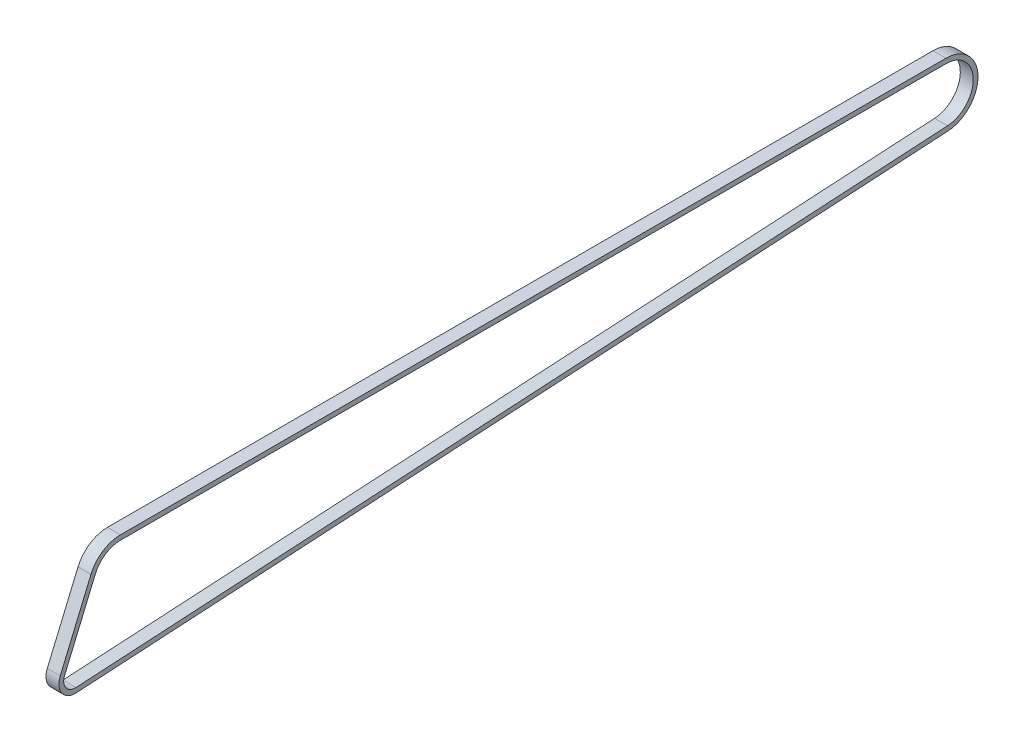
ISO-10303-21;
HEADER;
FILE_DESCRIPTION(('STEP AP214'),'2;1');
FILE_NAME('part.step','',(''),(''),'','','');
FILE_SCHEMA(('AUTOMOTIVE_DESIGN { 1 0 10303 214 1 1 1 1 }'));
ENDSEC;
DATA;
#1=APPLICATION_CONTEXT('core data for automotive mechanical design processes');
#2=APPLICATION_PROTOCOL_DEFINITION('international standard','automotive_design',2000,#1);
#3=PRODUCT_CONTEXT('',#1,'mechanical');
#4=PRODUCT('Part','Part','',(#3));
#5=PRODUCT_RELATED_PRODUCT_CATEGORY('part','',(#4));
#6=PRODUCT_DEFINITION_FORMATION('','',#4);
#7=PRODUCT_DEFINITION_CONTEXT('part definition',#1,'design');
#8=PRODUCT_DEFINITION('design','',#6,#7);
#9=PRODUCT_DEFINITION_SHAPE('','',#8);
#10=(LENGTH_UNIT() NAMED_UNIT(*) SI_UNIT(.MILLI.,.METRE.));
#11=(NAMED_UNIT(*) PLANE_ANGLE_UNIT() SI_UNIT($,.RADIAN.));
#12=(NAMED_UNIT(*) SI_UNIT($,.STERADIAN.) SOLID_ANGLE_UNIT());
#13=UNCERTAINTY_MEASURE_WITH_UNIT(LENGTH_MEASURE(1.E-05),#10,'distance_accuracy_value','');
#14=(GEOMETRIC_REPRESENTATION_CONTEXT(3) GLOBAL_UNCERTAINTY_ASSIGNED_CONTEXT((#13)) GLOBAL_UNIT_ASSIGNED_CONTEXT((#10,
#11,#12)) REPRESENTATION_CONTEXT('',''));
#15=CARTESIAN_POINT('',(0.,0.,0.));
#16=DIRECTION('',(0.,0.,1.));
#17=DIRECTION('',(1.,0.,0.));
#18=AXIS2_PLACEMENT_3D('',#15,#16,#17);
#19=CARTESIAN_POINT('',(0.,0.,0.));
#20=DIRECTION('',(-1.,0.,0.));
#21=DIRECTION('',(0.,0.,1.));
#22=AXIS2_PLACEMENT_3D('',#19,#20,#21);
#23=CYLINDRICAL_SURFACE('',#22,7.5564349965101);
#24=DIRECTION('',(-1.,0.,0.));
#25=VECTOR('',#24,1.);
#26=CARTESIAN_POINT('',(-3.,-7.54369576801666,-0.438593223944628));
#27=LINE('',#26,#25);
#28=CARTESIAN_POINT('',(3.,-7.54369576801666,-0.438593223944628));
#29=VERTEX_POINT('',#28);
#30=CARTESIAN_POINT('',(-3.,-7.54369576801666,-0.438593223944628));
#31=VERTEX_POINT('',#30);
#32=EDGE_CURVE('E250',#29,#31,#27,.T.);
#33=ORIENTED_EDGE('',*,*,#32,.F.);
#34=CARTESIAN_POINT('',(3.,0.,0.));
#35=DIRECTION('',(-1.,0.,0.));
#36=DIRECTION('',(0.,0.,1.));
#37=AXIS2_PLACEMENT_3D('',#34,#35,#36);
#38=CIRCLE('',#37,7.5564349965101);
#39=CARTESIAN_POINT('',(3.,2.94703128453617,6.95806844350122));
#40=VERTEX_POINT('',#39);
#41=EDGE_CURVE('E43',#29,#40,#38,.T.);
#42=ORIENTED_EDGE('',*,*,#41,.T.);
#43=CARTESIAN_POINT('',(3.,2.94703128453614,6.95806844350124));
#44=DIRECTION('',(-1.,0.,0.));
#45=VECTOR('',#44,1.);
#46=LINE('',#43,#45);
#47=CARTESIAN_POINT('',(-3.,2.94703128453614,6.95806844350124));
#48=VERTEX_POINT('',#47);
#49=EDGE_CURVE('E165',#40,#48,#46,.T.);
#50=ORIENTED_EDGE('',*,*,#49,.T.);
#51=CARTESIAN_POINT('',(-3.,0.,0.));
#52=DIRECTION('',(-1.,0.,0.));
#53=DIRECTION('',(0.,0.,1.));
#54=AXIS2_PLACEMENT_3D('',#51,#52,#53);
#55=CIRCLE('',#54,7.5564349965101);
#56=EDGE_CURVE('E11',#31,#48,#55,.T.);
#57=ORIENTED_EDGE('',*,*,#56,.F.);
#58=EDGE_LOOP('',(#33,#42,#50,#57));
#59=FACE_BOUND('',#58,.T.);
#60=ADVANCED_FACE('F32',(#59),#23,.T.);
#61=CARTESIAN_POINT('',(0.,0.,0.));
#62=DIRECTION('',(-1.,0.,0.));
#63=DIRECTION('',(0.,0.,1.));
#64=AXIS2_PLACEMENT_3D('',#61,#62,#63);
#65=CYLINDRICAL_SURFACE('',#64,5.35643499651009);
#66=DIRECTION('',(1.,0.,0.));
#67=VECTOR('',#66,1.);
#68=CARTESIAN_POINT('',(-3.,-5.34740469990034,-0.310900060022268));
#69=LINE('',#68,#67);
#70=CARTESIAN_POINT('',(-3.,-5.34740469990034,-0.310900060022268));
#71=VERTEX_POINT('',#70);
#72=CARTESIAN_POINT('',(3.,-5.34740469990034,-0.310900060022268));
#73=VERTEX_POINT('',#72);
#74=EDGE_CURVE('E257',#71,#73,#69,.T.);
#75=ORIENTED_EDGE('',*,*,#74,.F.);
#76=CARTESIAN_POINT('',(-3.,0.,0.));
#77=DIRECTION('',(-1.,0.,0.));
#78=DIRECTION('',(0.,0.,1.));
#79=AXIS2_PLACEMENT_3D('',#76,#77,#78);
#80=CIRCLE('',#79,5.35643499651009);
#81=CARTESIAN_POINT('',(-3.,2.08902498540513,4.93227842707517));
#82=VERTEX_POINT('',#81);
#83=EDGE_CURVE('E59',#71,#82,#80,.T.);
#84=ORIENTED_EDGE('',*,*,#83,.T.);
#85=CARTESIAN_POINT('',(-3.,2.08902498540513,4.93227842707517));
#86=DIRECTION('',(1.,0.,0.));
#87=VECTOR('',#86,1.);
#88=LINE('',#85,#87);
#89=CARTESIAN_POINT('',(3.,2.08902498540517,4.93227842707515));
#90=VERTEX_POINT('',#89);
#91=EDGE_CURVE('E151',#82,#90,#88,.T.);
#92=ORIENTED_EDGE('',*,*,#91,.T.);
#93=CARTESIAN_POINT('',(3.,0.,0.));
#94=DIRECTION('',(-1.,0.,0.));
#95=DIRECTION('',(0.,0.,1.));
#96=AXIS2_PLACEMENT_3D('',#93,#94,#95);
#97=CIRCLE('',#96,5.35643499651009);
#98=EDGE_CURVE('E274',#73,#90,#97,.T.);
#99=ORIENTED_EDGE('',*,*,#98,.F.);
#100=EDGE_LOOP('',(#75,#84,#92,#99));
#101=FACE_BOUND('',#100,.T.);
#102=ADVANCED_FACE('F217',(#101),#65,.F.);
#103=CARTESIAN_POINT('',(-3.,15.919956904702,-404.007658376128));
#104=DIRECTION('',(0.,0.998314121871051,0.0580423472374411));
#105=DIRECTION('',(0.,-0.0580423472374411,0.998314121871051));
#106=AXIS2_PLACEMENT_3D('',#103,#104,#105);
#107=PLANE('',#106);
#108=DIRECTION('',(-1.,0.,0.));
#109=VECTOR('',#108,1.);
#110=CARTESIAN_POINT('',(-3.,15.919956904702,-404.007658376128));
#111=LINE('',#110,#109);
#112=CARTESIAN_POINT('',(3.,15.919956904702,-404.007658376128));
#113=VERTEX_POINT('',#112);
#114=CARTESIAN_POINT('',(-3.,15.919956904702,-404.007658376128));
#115=VERTEX_POINT('',#114);
#116=EDGE_CURVE('E298',#113,#115,#111,.T.);
#117=ORIENTED_EDGE('',*,*,#116,.F.);
#118=DIRECTION('',(0.,-0.0580423472374411,0.998314121871051));
#119=VECTOR('',#118,1.);
#120=CARTESIAN_POINT('',(3.,15.919956904702,-404.007658376128));
#121=LINE('',#120,#119);
#122=EDGE_CURVE('E255',#113,#29,#121,.T.);
#123=ORIENTED_EDGE('',*,*,#122,.T.);
#124=ORIENTED_EDGE('',*,*,#32,.T.);
#125=DIRECTION('',(0.,-0.0580423472374411,0.998314121871051));
#126=VECTOR('',#125,1.);
#127=CARTESIAN_POINT('',(-3.,15.919956904702,-404.007658376128));
#128=LINE('',#127,#126);
#129=EDGE_CURVE('E247',#115,#31,#128,.T.);
#130=ORIENTED_EDGE('',*,*,#129,.F.);
#131=EDGE_LOOP('',(#117,#123,#124,#130));
#132=FACE_BOUND('',#131,.T.);
#133=ADVANCED_FACE('F214',(#132),#107,.F.);
#134=CARTESIAN_POINT('',(-3.,18.1162479728183,-403.879965212205));
#135=DIRECTION('',(0.,-0.998314121871051,-0.0580423472374411));
#136=DIRECTION('',(0.,0.0580423472374411,-0.998314121871051));
#137=AXIS2_PLACEMENT_3D('',#134,#135,#136);
#138=PLANE('',#137);
#139=DIRECTION('',(1.,0.,0.));
#140=VECTOR('',#139,1.);
#141=CARTESIAN_POINT('',(-3.,18.1162479728183,-403.879965212205));
#142=LINE('',#141,#140);
#143=CARTESIAN_POINT('',(-3.,18.1162479728183,-403.879965212205));
#144=VERTEX_POINT('',#143);
#145=CARTESIAN_POINT('',(3.,18.1162479728183,-403.879965212205));
#146=VERTEX_POINT('',#145);
#147=EDGE_CURVE('E293',#144,#146,#142,.T.);
#148=ORIENTED_EDGE('',*,*,#147,.F.);
#149=DIRECTION('',(0.,-0.0580423472374411,0.998314121871051));
#150=VECTOR('',#149,1.);
#151=CARTESIAN_POINT('',(-3.,18.1162479728183,-403.879965212205));
#152=LINE('',#151,#150);
#153=EDGE_CURVE('E256',#144,#71,#152,.T.);
#154=ORIENTED_EDGE('',*,*,#153,.T.);
#155=ORIENTED_EDGE('',*,*,#74,.T.);
#156=DIRECTION('',(0.,-0.0580423472374411,0.998314121871051));
#157=VECTOR('',#156,1.);
#158=CARTESIAN_POINT('',(3.,18.1162479728183,-403.879965212205));
#159=LINE('',#158,#157);
#160=EDGE_CURVE('E260',#146,#73,#159,.T.);
#161=ORIENTED_EDGE('',*,*,#160,.F.);
#162=EDGE_LOOP('',(#148,#154,#155,#161));
#163=FACE_BOUND('',#162,.T.);
#164=ADVANCED_FACE('F210',(#163),#138,.F.);
#165=CARTESIAN_POINT('',(0.,30.7449216144871,-403.145729519651));
#166=DIRECTION('',(-1.,0.,0.));
#167=DIRECTION('',(0.,0.,1.));
#168=AXIS2_PLACEMENT_3D('',#165,#166,#167);
#169=CYLINDRICAL_SURFACE('',#168,14.85);
#170=DIRECTION('',(-1.,0.,0.));
#171=VECTOR('',#170,1.);
#172=CARTESIAN_POINT('',(-3.,45.5949216144871,-403.145729519652));
#173=LINE('',#172,#171);
#174=CARTESIAN_POINT('',(3.,45.5949216144871,-403.145729519652));
#175=VERTEX_POINT('',#174);
#176=CARTESIAN_POINT('',(-3.,45.5949216144871,-403.145729519652));
#177=VERTEX_POINT('',#176);
#178=EDGE_CURVE('E302',#175,#177,#173,.T.);
#179=ORIENTED_EDGE('',*,*,#178,.F.);
#180=CARTESIAN_POINT('',(3.,30.7449216144871,-403.145729519651));
#181=DIRECTION('',(-1.,0.,0.));
#182=DIRECTION('',(0.,0.,1.));
#183=AXIS2_PLACEMENT_3D('',#180,#181,#182);
#184=CIRCLE('',#183,14.85);
#185=EDGE_CURVE('E318',#175,#113,#184,.T.);
#186=ORIENTED_EDGE('',*,*,#185,.T.);
#187=ORIENTED_EDGE('',*,*,#116,.T.);
#188=CARTESIAN_POINT('',(-3.,30.7449216144871,-403.145729519651));
#189=DIRECTION('',(-1.,0.,0.));
#190=DIRECTION('',(0.,0.,1.));
#191=AXIS2_PLACEMENT_3D('',#188,#189,#190);
#192=CIRCLE('',#191,14.85);
#193=EDGE_CURVE('E263',#177,#115,#192,.T.);
#194=ORIENTED_EDGE('',*,*,#193,.F.);
#195=EDGE_LOOP('',(#179,#186,#187,#194));
#196=FACE_BOUND('',#195,.T.);
#197=ADVANCED_FACE('F206',(#196),#169,.T.);
#198=CARTESIAN_POINT('',(0.,30.7449216144871,-403.145729519651));
#199=DIRECTION('',(-1.,0.,0.));
#200=DIRECTION('',(0.,0.,1.));
#201=AXIS2_PLACEMENT_3D('',#198,#199,#200);
#202=CYLINDRICAL_SURFACE('',#201,12.65);
#203=DIRECTION('',(1.,0.,0.));
#204=VECTOR('',#203,1.);
#205=CARTESIAN_POINT('',(-3.,43.3949216144871,-403.145729519652));
#206=LINE('',#205,#204);
#207=CARTESIAN_POINT('',(-3.,43.3949216144871,-403.145729519652));
#208=VERTEX_POINT('',#207);
#209=CARTESIAN_POINT('',(3.,43.3949216144871,-403.145729519652));
#210=VERTEX_POINT('',#209);
#211=EDGE_CURVE('E243',#208,#210,#206,.T.);
#212=ORIENTED_EDGE('',*,*,#211,.F.);
#213=CARTESIAN_POINT('',(-3.,30.7449216144871,-403.145729519651));
#214=DIRECTION('',(-1.,0.,0.));
#215=DIRECTION('',(0.,0.,1.));
#216=AXIS2_PLACEMENT_3D('',#213,#214,#215);
#217=CIRCLE('',#216,12.65);
#218=EDGE_CURVE('E295',#208,#144,#217,.T.);
#219=ORIENTED_EDGE('',*,*,#218,.T.);
#220=ORIENTED_EDGE('',*,*,#147,.T.);
#221=CARTESIAN_POINT('',(3.,30.7449216144871,-403.145729519651));
#222=DIRECTION('',(-1.,0.,0.));
#223=DIRECTION('',(0.,0.,1.));
#224=AXIS2_PLACEMENT_3D('',#221,#222,#223);
#225=CIRCLE('',#224,12.65);
#226=EDGE_CURVE('E297',#210,#146,#225,.T.);
#227=ORIENTED_EDGE('',*,*,#226,.F.);
#228=EDGE_LOOP('',(#212,#219,#220,#227));
#229=FACE_BOUND('',#228,.T.);
#230=ADVANCED_FACE('F202',(#229),#202,.F.);
#231=CARTESIAN_POINT('',(-3.,45.5949216144885,-20.9425355417859));
#232=DIRECTION('',(0.,-1.,0.));
#233=DIRECTION('',(0.,0.,-1.));
#234=AXIS2_PLACEMENT_3D('',#231,#232,#233);
#235=PLANE('',#234);
#236=DIRECTION('',(-1.,0.,0.));
#237=VECTOR('',#236,1.);
#238=CARTESIAN_POINT('',(-3.,45.5949216144885,-20.9425355417859));
#239=LINE('',#238,#237);
#240=CARTESIAN_POINT('',(3.,45.5949216144885,-20.9425355417859));
#241=VERTEX_POINT('',#240);
#242=CARTESIAN_POINT('',(-3.,45.5949216144885,-20.9425355417859));
#243=VERTEX_POINT('',#242);
#244=EDGE_CURVE('E140',#241,#243,#239,.T.);
#245=ORIENTED_EDGE('',*,*,#244,.F.);
#246=DIRECTION('',(0.,0.,-1.));
#247=VECTOR('',#246,1.);
#248=CARTESIAN_POINT('',(3.,45.5949216144885,-20.9425355417859));
#249=LINE('',#248,#247);
#250=EDGE_CURVE('E306',#241,#175,#249,.T.);
#251=ORIENTED_EDGE('',*,*,#250,.T.);
#252=ORIENTED_EDGE('',*,*,#178,.T.);
#253=DIRECTION('',(0.,0.,-1.));
#254=VECTOR('',#253,1.);
#255=CARTESIAN_POINT('',(-3.,45.5949216144885,-20.9425355417859));
#256=LINE('',#255,#254);
#257=EDGE_CURVE('E313',#243,#177,#256,.T.);
#258=ORIENTED_EDGE('',*,*,#257,.F.);
#259=EDGE_LOOP('',(#245,#251,#252,#258));
#260=FACE_BOUND('',#259,.T.);
#261=ADVANCED_FACE('F198',(#260),#235,.F.);
#262=CARTESIAN_POINT('',(-3.,43.3949216144885,-20.9425355417859));
#263=DIRECTION('',(0.,1.,0.));
#264=DIRECTION('',(0.,0.,1.));
#265=AXIS2_PLACEMENT_3D('',#262,#263,#264);
#266=PLANE('',#265);
#267=DIRECTION('',(1.,0.,0.));
#268=VECTOR('',#267,1.);
#269=CARTESIAN_POINT('',(-3.,43.3949216144885,-20.9425355417859));
#270=LINE('',#269,#268);
#271=CARTESIAN_POINT('',(-3.,43.3949216144885,-20.9425355417859));
#272=VERTEX_POINT('',#271);
#273=CARTESIAN_POINT('',(3.,43.3949216144885,-20.9425355417859));
#274=VERTEX_POINT('',#273);
#275=EDGE_CURVE('E231',#272,#274,#270,.T.);
#276=ORIENTED_EDGE('',*,*,#275,.F.);
#277=DIRECTION('',(0.,0.,-1.));
#278=VECTOR('',#277,1.);
#279=CARTESIAN_POINT('',(-3.,43.3949216144885,-20.9425355417859));
#280=LINE('',#279,#278);
#281=EDGE_CURVE('E135',#272,#208,#280,.T.);
#282=ORIENTED_EDGE('',*,*,#281,.T.);
#283=ORIENTED_EDGE('',*,*,#211,.T.);
#284=DIRECTION('',(0.,0.,-1.));
#285=VECTOR('',#284,1.);
#286=CARTESIAN_POINT('',(3.,43.3949216144885,-20.9425355417859));
#287=LINE('',#286,#285);
#288=EDGE_CURVE('E304',#274,#210,#287,.T.);
#289=ORIENTED_EDGE('',*,*,#288,.F.);
#290=EDGE_LOOP('',(#276,#282,#283,#289));
#291=FACE_BOUND('',#290,.T.);
#292=ADVANCED_FACE('F194',(#291),#266,.F.);
#293=CARTESIAN_POINT('',(0.,30.7449216144885,-20.9425355417858));
#294=DIRECTION('',(-1.,0.,0.));
#295=DIRECTION('',(0.,0.,1.));
#296=AXIS2_PLACEMENT_3D('',#293,#294,#295);
#297=CYLINDRICAL_SURFACE('',#296,14.85);
#298=DIRECTION('',(-1.,0.,0.));
#299=VECTOR('',#298,1.);
#300=CARTESIAN_POINT('',(-3.,36.5364641336227,-7.26845293090983));
#301=LINE('',#300,#299);
#302=CARTESIAN_POINT('',(3.,36.5364641336227,-7.26845293090983));
#303=VERTEX_POINT('',#302);
#304=CARTESIAN_POINT('',(-3.,36.5364641336227,-7.26845293090983));
#305=VERTEX_POINT('',#304);
#306=EDGE_CURVE('E148',#303,#305,#301,.T.);
#307=ORIENTED_EDGE('',*,*,#306,.F.);
#308=CARTESIAN_POINT('',(3.,30.7449216144885,-20.9425355417858));
#309=DIRECTION('',(-1.,0.,0.));
#310=DIRECTION('',(0.,0.,1.));
#311=AXIS2_PLACEMENT_3D('',#308,#309,#310);
#312=CIRCLE('',#311,14.85);
#313=EDGE_CURVE('E236',#303,#241,#312,.T.);
#314=ORIENTED_EDGE('',*,*,#313,.T.);
#315=ORIENTED_EDGE('',*,*,#244,.T.);
#316=CARTESIAN_POINT('',(-3.,30.7449216144885,-20.9425355417858));
#317=DIRECTION('',(-1.,0.,0.));
#318=DIRECTION('',(0.,0.,1.));
#319=AXIS2_PLACEMENT_3D('',#316,#317,#318);
#320=CIRCLE('',#319,14.85);
#321=EDGE_CURVE('E240',#305,#243,#320,.T.);
#322=ORIENTED_EDGE('',*,*,#321,.F.);
#323=EDGE_LOOP('',(#307,#314,#315,#322));
#324=FACE_BOUND('',#323,.T.);
#325=ADVANCED_FACE('F191',(#324),#297,.T.);
#326=CARTESIAN_POINT('',(0.,30.7449216144885,-20.9425355417858));
#327=DIRECTION('',(-1.,0.,0.));
#328=DIRECTION('',(0.,0.,1.));
#329=AXIS2_PLACEMENT_3D('',#326,#327,#328);
#330=CYLINDRICAL_SURFACE('',#329,12.65);
#331=DIRECTION('',(1.,0.,0.));
#332=VECTOR('',#331,1.);
#333=CARTESIAN_POINT('',(-3.,35.6784578344917,-9.2942429473359));
#334=LINE('',#333,#332);
#335=CARTESIAN_POINT('',(-3.,35.6784578344917,-9.2942429473359));
#336=VERTEX_POINT('',#335);
#337=CARTESIAN_POINT('',(3.,35.6784578344917,-9.2942429473359));
#338=VERTEX_POINT('',#337);
#339=EDGE_CURVE('E143',#336,#338,#334,.T.);
#340=ORIENTED_EDGE('',*,*,#339,.F.);
#341=CARTESIAN_POINT('',(-3.,30.7449216144885,-20.9425355417858));
#342=DIRECTION('',(-1.,0.,0.));
#343=DIRECTION('',(0.,0.,1.));
#344=AXIS2_PLACEMENT_3D('',#341,#342,#343);
#345=CIRCLE('',#344,12.65);
#346=EDGE_CURVE('E127',#336,#272,#345,.T.);
#347=ORIENTED_EDGE('',*,*,#346,.T.);
#348=ORIENTED_EDGE('',*,*,#275,.T.);
#349=CARTESIAN_POINT('',(3.,30.7449216144885,-20.9425355417858));
#350=DIRECTION('',(-1.,0.,0.));
#351=DIRECTION('',(0.,0.,1.));
#352=AXIS2_PLACEMENT_3D('',#349,#350,#351);
#353=CIRCLE('',#352,12.65);
#354=EDGE_CURVE('E139',#338,#274,#353,.T.);
#355=ORIENTED_EDGE('',*,*,#354,.F.);
#356=EDGE_LOOP('',(#340,#347,#348,#355));
#357=FACE_BOUND('',#356,.T.);
#358=ADVANCED_FACE('F144',(#357),#330,.F.);
#359=CARTESIAN_POINT('',(-3.,36.5364641336227,-7.26845293090983));
#360=DIRECTION('',(-1.,0.,0.));
#361=DIRECTION('',(0.,0.,1.));
#362=AXIS2_PLACEMENT_3D('',#359,#360,#361);
#363=PLANE('',#362);
#364=ORIENTED_EDGE('',*,*,#346,.F.);
#365=DIRECTION('',(0.,-0.920813643830031,0.390002863241363));
#366=VECTOR('',#365,1.);
#367=CARTESIAN_POINT('',(-3.,35.6784578344917,-9.2942429473359));
#368=LINE('',#367,#366);
#369=EDGE_CURVE('E132',#336,#82,#368,.T.);
#370=ORIENTED_EDGE('',*,*,#369,.T.);
#371=ORIENTED_EDGE('',*,*,#83,.F.);
#372=ORIENTED_EDGE('',*,*,#153,.F.);
#373=ORIENTED_EDGE('',*,*,#218,.F.);
#374=ORIENTED_EDGE('',*,*,#281,.F.);
#375=EDGE_LOOP('',(#364,#370,#371,#372,#373,#374));
#376=FACE_BOUND('',#375,.T.);
#377=DIRECTION('',(0.,-0.920813643830031,0.390002863241363));
#378=VECTOR('',#377,1.);
#379=CARTESIAN_POINT('',(-3.,36.5364641336227,-7.26845293090983));
#380=LINE('',#379,#378);
#381=EDGE_CURVE('E51',#305,#48,#380,.T.);
#382=ORIENTED_EDGE('',*,*,#381,.F.);
#383=ORIENTED_EDGE('',*,*,#321,.T.);
#384=ORIENTED_EDGE('',*,*,#257,.T.);
#385=ORIENTED_EDGE('',*,*,#193,.T.);
#386=ORIENTED_EDGE('',*,*,#129,.T.);
#387=ORIENTED_EDGE('',*,*,#56,.T.);
#388=EDGE_LOOP('',(#382,#383,#384,#385,#386,#387));
#389=FACE_BOUND('',#388,.T.);
#390=ADVANCED_FACE('F129',(#376,#389),#363,.T.);
#391=CARTESIAN_POINT('',(-3.,36.5364641336227,-7.26845293090983));
#392=DIRECTION('',(0.,0.390002863241363,0.920813643830031));
#393=DIRECTION('',(0.,-0.920813643830031,0.390002863241363));
#394=AXIS2_PLACEMENT_3D('',#391,#392,#393);
#395=PLANE('',#394);
#396=ORIENTED_EDGE('',*,*,#49,.F.);
#397=DIRECTION('',(0.,-0.920813643830031,0.390002863241363));
#398=VECTOR('',#397,1.);
#399=CARTESIAN_POINT('',(3.,36.5364641336227,-7.26845293090983));
#400=LINE('',#399,#398);
#401=EDGE_CURVE('E154',#303,#40,#400,.T.);
#402=ORIENTED_EDGE('',*,*,#401,.F.);
#403=ORIENTED_EDGE('',*,*,#306,.T.);
#404=ORIENTED_EDGE('',*,*,#381,.T.);
#405=EDGE_LOOP('',(#396,#402,#403,#404));
#406=FACE_BOUND('',#405,.T.);
#407=ADVANCED_FACE('F172',(#406),#395,.T.);
#408=CARTESIAN_POINT('',(3.,36.5364641336227,-7.26845293090983));
#409=DIRECTION('',(1.,0.,0.));
#410=DIRECTION('',(0.,0.,-1.));
#411=AXIS2_PLACEMENT_3D('',#408,#409,#410);
#412=PLANE('',#411);
#413=ORIENTED_EDGE('',*,*,#313,.F.);
#414=ORIENTED_EDGE('',*,*,#401,.T.);
#415=ORIENTED_EDGE('',*,*,#41,.F.);
#416=ORIENTED_EDGE('',*,*,#122,.F.);
#417=ORIENTED_EDGE('',*,*,#185,.F.);
#418=ORIENTED_EDGE('',*,*,#250,.F.);
#419=EDGE_LOOP('',(#413,#414,#415,#416,#417,#418));
#420=FACE_BOUND('',#419,.T.);
#421=DIRECTION('',(0.,-0.920813643830031,0.390002863241363));
#422=VECTOR('',#421,1.);
#423=CARTESIAN_POINT('',(3.,35.6784578344917,-9.2942429473359));
#424=LINE('',#423,#422);
#425=EDGE_CURVE('E152',#338,#90,#424,.T.);
#426=ORIENTED_EDGE('',*,*,#425,.F.);
#427=ORIENTED_EDGE('',*,*,#354,.T.);
#428=ORIENTED_EDGE('',*,*,#288,.T.);
#429=ORIENTED_EDGE('',*,*,#226,.T.);
#430=ORIENTED_EDGE('',*,*,#160,.T.);
#431=ORIENTED_EDGE('',*,*,#98,.T.);
#432=EDGE_LOOP('',(#426,#427,#428,#429,#430,#431));
#433=FACE_BOUND('',#432,.T.);
#434=ADVANCED_FACE('F181',(#420,#433),#412,.T.);
#435=CARTESIAN_POINT('',(-3.,35.6784578344917,-9.2942429473359));
#436=DIRECTION('',(0.,-0.390002863241363,-0.920813643830031));
#437=DIRECTION('',(0.,0.920813643830031,-0.390002863241363));
#438=AXIS2_PLACEMENT_3D('',#435,#436,#437);
#439=PLANE('',#438);
#440=ORIENTED_EDGE('',*,*,#91,.F.);
#441=ORIENTED_EDGE('',*,*,#369,.F.);
#442=ORIENTED_EDGE('',*,*,#339,.T.);
#443=ORIENTED_EDGE('',*,*,#425,.T.);
#444=EDGE_LOOP('',(#440,#441,#442,#443));
#445=FACE_BOUND('',#444,.T.);
#446=ADVANCED_FACE('F150',(#445),#439,.T.);
#447=CLOSED_SHELL('',(#60,#102,#133,#164,#197,#230,#261,#292,#325,#358,#390,#407,#434,#446));
#448=MANIFOLD_SOLID_BREP('B2',#447);
#449=ADVANCED_BREP_SHAPE_REPRESENTATION('',(#18,#448),#14);
#450=SHAPE_DEFINITION_REPRESENTATION(#9,#449);
ENDSEC;
END-ISO-10303-21;
